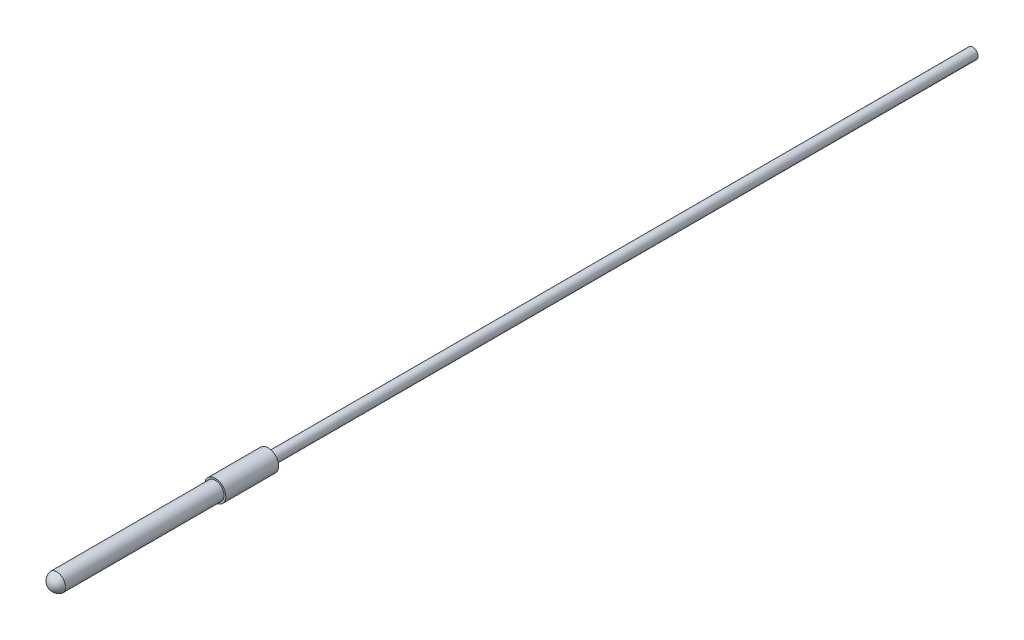
ISO-10303-21;
HEADER;
FILE_DESCRIPTION(('STEP AP214'),'2;1');
FILE_NAME('part.step','',(''),(''),'','','');
FILE_SCHEMA(('AUTOMOTIVE_DESIGN { 1 0 10303 214 1 1 1 1 }'));
ENDSEC;
DATA;
#1=APPLICATION_CONTEXT('core data for automotive mechanical design processes');
#2=APPLICATION_PROTOCOL_DEFINITION('international standard','automotive_design',2000,#1);
#3=PRODUCT_CONTEXT('',#1,'mechanical');
#4=PRODUCT('Part','Part','',(#3));
#5=PRODUCT_RELATED_PRODUCT_CATEGORY('part','',(#4));
#6=PRODUCT_DEFINITION_FORMATION('','',#4);
#7=PRODUCT_DEFINITION_CONTEXT('part definition',#1,'design');
#8=PRODUCT_DEFINITION('design','',#6,#7);
#9=PRODUCT_DEFINITION_SHAPE('','',#8);
#10=(LENGTH_UNIT() NAMED_UNIT(*) SI_UNIT(.MILLI.,.METRE.));
#11=(NAMED_UNIT(*) PLANE_ANGLE_UNIT() SI_UNIT($,.RADIAN.));
#12=(NAMED_UNIT(*) SI_UNIT($,.STERADIAN.) SOLID_ANGLE_UNIT());
#13=UNCERTAINTY_MEASURE_WITH_UNIT(LENGTH_MEASURE(1.E-05),#10,'distance_accuracy_value','');
#14=(GEOMETRIC_REPRESENTATION_CONTEXT(3) GLOBAL_UNCERTAINTY_ASSIGNED_CONTEXT((#13)) GLOBAL_UNIT_ASSIGNED_CONTEXT((#10,
#11,#12)) REPRESENTATION_CONTEXT('',''));
#15=CARTESIAN_POINT('',(0.,0.,0.));
#16=DIRECTION('',(0.,0.,1.));
#17=DIRECTION('',(1.,0.,0.));
#18=AXIS2_PLACEMENT_3D('',#15,#16,#17);
#19=CARTESIAN_POINT('',(0.,0.,45.));
#20=DIRECTION('',(0.,0.,-1.));
#21=DIRECTION('',(-1.,0.,0.));
#22=AXIS2_PLACEMENT_3D('',#19,#20,#21);
#23=CYLINDRICAL_SURFACE('',#22,2.5);
#24=CARTESIAN_POINT('',(0.,0.,45.));
#25=DIRECTION('',(0.,0.,1.));
#26=DIRECTION('',(1.,0.,0.));
#27=AXIS2_PLACEMENT_3D('',#24,#25,#26);
#28=CIRCLE('',#27,2.5);
#29=CARTESIAN_POINT('',(-2.5,0.,45.));
#30=VERTEX_POINT('',#29);
#31=EDGE_CURVE('E36',#30,#30,#28,.T.);
#32=CARTESIAN_POINT('',(0.,0.,0.));
#33=DIRECTION('',(0.,0.,1.));
#34=DIRECTION('',(1.,0.,0.));
#35=AXIS2_PLACEMENT_3D('',#32,#33,#34);
#36=CIRCLE('',#35,2.5);
#37=CARTESIAN_POINT('',(-2.5,0.,0.));
#38=VERTEX_POINT('',#37);
#39=EDGE_CURVE('E44',#38,#38,#36,.T.);
#40=CARTESIAN_POINT('',(-2.5,0.,45.));
#41=CARTESIAN_POINT('',(-2.5,0.,44.53125));
#42=CARTESIAN_POINT('',(-2.5,0.,44.0625));
#43=CARTESIAN_POINT('',(-2.5,0.,43.125));
#44=CARTESIAN_POINT('',(-2.5,0.,42.65625));
#45=CARTESIAN_POINT('',(-2.5,0.,41.71875));
#46=CARTESIAN_POINT('',(-2.5,0.,41.25));
#47=CARTESIAN_POINT('',(-2.5,0.,40.3125));
#48=CARTESIAN_POINT('',(-2.5,0.,39.84375));
#49=CARTESIAN_POINT('',(-2.5,0.,38.90625));
#50=CARTESIAN_POINT('',(-2.5,0.,38.4375));
#51=CARTESIAN_POINT('',(-2.5,0.,37.5));
#52=CARTESIAN_POINT('',(-2.5,0.,37.03125));
#53=CARTESIAN_POINT('',(-2.5,0.,36.09375));
#54=CARTESIAN_POINT('',(-2.5,0.,35.625));
#55=CARTESIAN_POINT('',(-2.5,0.,34.6875));
#56=CARTESIAN_POINT('',(-2.5,0.,34.21875));
#57=CARTESIAN_POINT('',(-2.5,0.,33.28125));
#58=CARTESIAN_POINT('',(-2.5,0.,32.8125));
#59=CARTESIAN_POINT('',(-2.5,0.,31.875));
#60=CARTESIAN_POINT('',(-2.5,0.,31.40625));
#61=CARTESIAN_POINT('',(-2.5,0.,30.46875));
#62=CARTESIAN_POINT('',(-2.5,0.,30.));
#63=CARTESIAN_POINT('',(-2.5,0.,29.0625));
#64=CARTESIAN_POINT('',(-2.5,0.,28.59375));
#65=CARTESIAN_POINT('',(-2.5,0.,27.65625));
#66=CARTESIAN_POINT('',(-2.5,0.,27.1875));
#67=CARTESIAN_POINT('',(-2.5,0.,26.25));
#68=CARTESIAN_POINT('',(-2.5,0.,25.78125));
#69=CARTESIAN_POINT('',(-2.5,0.,24.84375));
#70=CARTESIAN_POINT('',(-2.5,0.,24.375));
#71=CARTESIAN_POINT('',(-2.5,0.,23.4375));
#72=CARTESIAN_POINT('',(-2.5,0.,22.96875));
#73=CARTESIAN_POINT('',(-2.5,0.,22.03125));
#74=CARTESIAN_POINT('',(-2.5,0.,21.5625));
#75=CARTESIAN_POINT('',(-2.5,0.,20.625));
#76=CARTESIAN_POINT('',(-2.5,0.,20.15625));
#77=CARTESIAN_POINT('',(-2.5,0.,19.21875));
#78=CARTESIAN_POINT('',(-2.5,0.,18.75));
#79=CARTESIAN_POINT('',(-2.5,0.,17.8125));
#80=CARTESIAN_POINT('',(-2.5,0.,17.34375));
#81=CARTESIAN_POINT('',(-2.5,0.,16.40625));
#82=CARTESIAN_POINT('',(-2.5,0.,15.9375));
#83=CARTESIAN_POINT('',(-2.5,0.,15.));
#84=CARTESIAN_POINT('',(-2.5,0.,14.53125));
#85=CARTESIAN_POINT('',(-2.5,0.,13.59375));
#86=CARTESIAN_POINT('',(-2.5,0.,13.125));
#87=CARTESIAN_POINT('',(-2.5,0.,12.1875));
#88=CARTESIAN_POINT('',(-2.5,0.,11.71875));
#89=CARTESIAN_POINT('',(-2.5,0.,10.78125));
#90=CARTESIAN_POINT('',(-2.5,0.,10.3125));
#91=CARTESIAN_POINT('',(-2.5,0.,9.37499999999999));
#92=CARTESIAN_POINT('',(-2.5,0.,8.90624999999999));
#93=CARTESIAN_POINT('',(-2.5,0.,7.96874999999999));
#94=CARTESIAN_POINT('',(-2.5,0.,7.5));
#95=CARTESIAN_POINT('',(-2.5,0.,6.56249999999999));
#96=CARTESIAN_POINT('',(-2.5,0.,6.09374999999999));
#97=CARTESIAN_POINT('',(-2.5,0.,5.15624999999999));
#98=CARTESIAN_POINT('',(-2.5,0.,4.68749999999999));
#99=CARTESIAN_POINT('',(-2.5,0.,3.74999999999999));
#100=CARTESIAN_POINT('',(-2.5,0.,3.28124999999999));
#101=CARTESIAN_POINT('',(-2.5,0.,2.34374999999999));
#102=CARTESIAN_POINT('',(-2.5,0.,1.87499999999999));
#103=CARTESIAN_POINT('',(-2.5,0.,0.937499999999992));
#104=CARTESIAN_POINT('',(-2.5,0.,0.468749999999993));
#105=CARTESIAN_POINT('',(-2.5,0.,0.));
#106=B_SPLINE_CURVE_WITH_KNOTS('',3,(#40,#41,#42,#43,#44,#45,#46,#47,#48,#49,#50,#51,#52,#53,
#54,#55,#56,#57,#58,#59,#60,#61,#62,#63,#64,#65,#66,#67,#68,#69,#70,#71,#72,#73,#74,#75,#76,#77,
#78,#79,#80,#81,#82,#83,#84,#85,#86,#87,#88,#89,#90,#91,#92,#93,#94,#95,#96,#97,#98,#99,#100,
#101,#102,#103,#104,#105),.UNSPECIFIED.,.F.,.F.,(4,2,2,2,2,2,2,2,2,2,2,2,2,2,2,2,2,2,2,2,2,2,2,
2,2,2,2,2,2,2,2,2,4),(0.,1.40625,2.8125,4.21874999999999,5.625,7.03125,8.43749999999999,9.84375,
11.25,12.65625,14.0625,15.46875,16.875,18.28125,19.6875,21.09375,22.5,23.90625,25.3125,26.71875,
28.125,29.53125,30.9375,32.34375,33.75,35.15625,36.5625,37.96875,39.375,40.78125,42.1875,
43.59375,45.),.UNSPECIFIED.);
#107=EDGE_CURVE('BSEAM32',#30,#38,#106,.T.);
#108=ORIENTED_EDGE('',*,*,#31,.F.);
#109=ORIENTED_EDGE('',*,*,#39,.T.);
#110=ORIENTED_EDGE('',*,*,#107,.T.);
#111=ORIENTED_EDGE('',*,*,#107,.F.);
#112=EDGE_LOOP('',(#108,#110,#109,#111));
#113=FACE_BOUND('',#112,.T.);
#114=ADVANCED_FACE('F32',(#113),#23,.T.);
#115=CARTESIAN_POINT('',(0.,0.,44.4375));
#116=DIRECTION('',(0.,0.,1.));
#117=DIRECTION('',(1.,0.,0.));
#118=AXIS2_PLACEMENT_3D('',#115,#116,#117);
#119=SPHERICAL_SURFACE('',#118,2.5625);
#120=ORIENTED_EDGE('',*,*,#31,.T.);
#121=EDGE_LOOP('',(#120));
#122=FACE_BOUND('',#121,.T.);
#123=ADVANCED_FACE('F34',(#122),#119,.T.);
#124=CARTESIAN_POINT('',(0.,0.,-15.));
#125=DIRECTION('',(0.,0.,1.));
#126=DIRECTION('',(1.,0.,0.));
#127=AXIS2_PLACEMENT_3D('',#124,#125,#126);
#128=CYLINDRICAL_SURFACE('',#127,3.);
#129=CARTESIAN_POINT('',(0.,0.,-15.));
#130=DIRECTION('',(0.,0.,-1.));
#131=DIRECTION('',(-1.,0.,0.));
#132=AXIS2_PLACEMENT_3D('',#129,#130,#131);
#133=CIRCLE('',#132,3.);
#134=CARTESIAN_POINT('',(3.,0.,-15.));
#135=VERTEX_POINT('',#134);
#136=EDGE_CURVE('E48',#135,#135,#133,.T.);
#137=CARTESIAN_POINT('',(0.,0.,0.));
#138=DIRECTION('',(0.,0.,-1.));
#139=DIRECTION('',(-1.,0.,0.));
#140=AXIS2_PLACEMENT_3D('',#137,#138,#139);
#141=CIRCLE('',#140,3.);
#142=CARTESIAN_POINT('',(3.,0.,0.));
#143=VERTEX_POINT('',#142);
#144=EDGE_CURVE('E51',#143,#143,#141,.T.);
#145=CARTESIAN_POINT('',(3.,0.,-15.));
#146=CARTESIAN_POINT('',(3.,0.,-14.84375));
#147=CARTESIAN_POINT('',(3.,0.,-14.6875));
#148=CARTESIAN_POINT('',(3.,0.,-14.375));
#149=CARTESIAN_POINT('',(3.,0.,-14.21875));
#150=CARTESIAN_POINT('',(3.,0.,-13.90625));
#151=CARTESIAN_POINT('',(3.,0.,-13.75));
#152=CARTESIAN_POINT('',(3.,0.,-13.4375));
#153=CARTESIAN_POINT('',(3.,0.,-13.28125));
#154=CARTESIAN_POINT('',(3.,0.,-12.96875));
#155=CARTESIAN_POINT('',(3.,0.,-12.8125));
#156=CARTESIAN_POINT('',(3.,0.,-12.5));
#157=CARTESIAN_POINT('',(3.,0.,-12.34375));
#158=CARTESIAN_POINT('',(3.,0.,-12.03125));
#159=CARTESIAN_POINT('',(3.,0.,-11.875));
#160=CARTESIAN_POINT('',(3.,0.,-11.5625));
#161=CARTESIAN_POINT('',(3.,0.,-11.40625));
#162=CARTESIAN_POINT('',(3.,0.,-11.09375));
#163=CARTESIAN_POINT('',(3.,0.,-10.9375));
#164=CARTESIAN_POINT('',(3.,0.,-10.625));
#165=CARTESIAN_POINT('',(3.,0.,-10.46875));
#166=CARTESIAN_POINT('',(3.,0.,-10.15625));
#167=CARTESIAN_POINT('',(3.,0.,-9.99999999999999));
#168=CARTESIAN_POINT('',(3.,0.,-9.68749999999999));
#169=CARTESIAN_POINT('',(3.,0.,-9.53125));
#170=CARTESIAN_POINT('',(3.,0.,-9.21875));
#171=CARTESIAN_POINT('',(3.,0.,-9.0625));
#172=CARTESIAN_POINT('',(3.,0.,-8.75));
#173=CARTESIAN_POINT('',(3.,0.,-8.59375));
#174=CARTESIAN_POINT('',(3.,0.,-8.28125));
#175=CARTESIAN_POINT('',(3.,0.,-8.125));
#176=CARTESIAN_POINT('',(3.,0.,-7.8125));
#177=CARTESIAN_POINT('',(3.,0.,-7.65625));
#178=CARTESIAN_POINT('',(3.,0.,-7.34375));
#179=CARTESIAN_POINT('',(3.,0.,-7.1875));
#180=CARTESIAN_POINT('',(3.,0.,-6.875));
#181=CARTESIAN_POINT('',(3.,0.,-6.71875));
#182=CARTESIAN_POINT('',(3.,0.,-6.40625));
#183=CARTESIAN_POINT('',(3.,0.,-6.25));
#184=CARTESIAN_POINT('',(3.,0.,-5.9375));
#185=CARTESIAN_POINT('',(3.,0.,-5.78125));
#186=CARTESIAN_POINT('',(3.,0.,-5.46875));
#187=CARTESIAN_POINT('',(3.,0.,-5.3125));
#188=CARTESIAN_POINT('',(3.,0.,-5.));
#189=CARTESIAN_POINT('',(3.,0.,-4.84375));
#190=CARTESIAN_POINT('',(3.,0.,-4.53125));
#191=CARTESIAN_POINT('',(3.,0.,-4.375));
#192=CARTESIAN_POINT('',(3.,0.,-4.0625));
#193=CARTESIAN_POINT('',(3.,0.,-3.90625));
#194=CARTESIAN_POINT('',(3.,0.,-3.59375));
#195=CARTESIAN_POINT('',(3.,0.,-3.4375));
#196=CARTESIAN_POINT('',(3.,0.,-3.125));
#197=CARTESIAN_POINT('',(3.,0.,-2.96875));
#198=CARTESIAN_POINT('',(3.,0.,-2.65625));
#199=CARTESIAN_POINT('',(3.,0.,-2.5));
#200=CARTESIAN_POINT('',(3.,0.,-2.1875));
#201=CARTESIAN_POINT('',(3.,0.,-2.03125));
#202=CARTESIAN_POINT('',(3.,0.,-1.71875));
#203=CARTESIAN_POINT('',(3.,0.,-1.5625));
#204=CARTESIAN_POINT('',(3.,0.,-1.25));
#205=CARTESIAN_POINT('',(3.,0.,-1.09375));
#206=CARTESIAN_POINT('',(3.,0.,-0.78125));
#207=CARTESIAN_POINT('',(3.,0.,-0.625));
#208=CARTESIAN_POINT('',(3.,0.,-0.3125));
#209=CARTESIAN_POINT('',(3.,0.,-0.15625));
#210=CARTESIAN_POINT('',(3.,0.,0.));
#211=B_SPLINE_CURVE_WITH_KNOTS('',3,(#145,#146,#147,#148,#149,#150,#151,#152,#153,#154,#155,
#156,#157,#158,#159,#160,#161,#162,#163,#164,#165,#166,#167,#168,#169,#170,#171,#172,#173,#174,
#175,#176,#177,#178,#179,#180,#181,#182,#183,#184,#185,#186,#187,#188,#189,#190,#191,#192,#193,
#194,#195,#196,#197,#198,#199,#200,#201,#202,#203,#204,#205,#206,#207,#208,#209,#210),
.UNSPECIFIED.,.F.,.F.,(4,2,2,2,2,2,2,2,2,2,2,2,2,2,2,2,2,2,2,2,2,2,2,2,2,2,2,2,2,2,2,2,4),(0.,
0.46875,0.937500000000001,1.40625,1.875,2.34375,2.8125,3.28125,3.75,4.21875,4.6875,5.15625,
5.625,6.09375,6.5625,7.03125,7.5,7.96875,8.43749999999999,8.90625,9.375,9.84374999999999,
10.3125,10.78125,11.25,11.71875,12.1875,12.65625,13.125,13.59375,14.0625,14.53125,15.),.UNSPECIFIED.);
#212=EDGE_CURVE('BSEAM65',#135,#143,#211,.T.);
#213=ORIENTED_EDGE('',*,*,#136,.F.);
#214=ORIENTED_EDGE('',*,*,#144,.T.);
#215=ORIENTED_EDGE('',*,*,#212,.T.);
#216=ORIENTED_EDGE('',*,*,#212,.F.);
#217=EDGE_LOOP('',(#213,#215,#214,#216));
#218=FACE_BOUND('',#217,.T.);
#219=ADVANCED_FACE('F65',(#218),#128,.T.);
#220=CARTESIAN_POINT('',(0.,0.,-15.));
#221=DIRECTION('',(0.,0.,-1.));
#222=DIRECTION('',(-1.,0.,0.));
#223=AXIS2_PLACEMENT_3D('',#220,#221,#222);
#224=PLANE('',#223);
#225=CARTESIAN_POINT('',(0.,0.,-15.));
#226=DIRECTION('',(0.,0.,-1.));
#227=DIRECTION('',(-1.,0.,0.));
#228=AXIS2_PLACEMENT_3D('',#225,#226,#227);
#229=CIRCLE('',#228,1.5);
#230=CARTESIAN_POINT('',(-1.5,0.,-15.));
#231=VERTEX_POINT('',#230);
#232=EDGE_CURVE('E10',#231,#231,#229,.T.);
#233=ORIENTED_EDGE('',*,*,#232,.F.);
#234=EDGE_LOOP('',(#233));
#235=FACE_BOUND('',#234,.T.);
#236=ORIENTED_EDGE('',*,*,#136,.T.);
#237=EDGE_LOOP('',(#236));
#238=FACE_BOUND('',#237,.T.);
#239=ADVANCED_FACE('F61',(#235,#238),#224,.T.);
#240=CARTESIAN_POINT('',(0.,0.,0.));
#241=DIRECTION('',(0.,0.,-1.));
#242=DIRECTION('',(-1.,0.,0.));
#243=AXIS2_PLACEMENT_3D('',#240,#241,#242);
#244=PLANE('',#243);
#245=ORIENTED_EDGE('',*,*,#39,.F.);
#246=EDGE_LOOP('',(#245));
#247=FACE_BOUND('',#246,.T.);
#248=ORIENTED_EDGE('',*,*,#144,.F.);
#249=EDGE_LOOP('',(#248));
#250=FACE_BOUND('',#249,.T.);
#251=ADVANCED_FACE('F57',(#247,#250),#244,.F.);
#252=CARTESIAN_POINT('',(0.,0.,-215.));
#253=DIRECTION('',(0.,0.,1.));
#254=DIRECTION('',(1.,0.,0.));
#255=AXIS2_PLACEMENT_3D('',#252,#253,#254);
#256=CYLINDRICAL_SURFACE('',#255,1.5);
#257=CARTESIAN_POINT('',(0.,0.,-215.));
#258=DIRECTION('',(0.,0.,-1.));
#259=DIRECTION('',(-1.,0.,0.));
#260=AXIS2_PLACEMENT_3D('',#257,#258,#259);
#261=CIRCLE('',#260,1.5);
#262=CARTESIAN_POINT('',(-1.5,0.,-215.));
#263=VERTEX_POINT('',#262);
#264=EDGE_CURVE('E47',#263,#263,#261,.T.);
#265=ORIENTED_EDGE('',*,*,#264,.F.);
#266=EDGE_LOOP('',(#265));
#267=FACE_BOUND('',#266,.T.);
#268=ORIENTED_EDGE('',*,*,#232,.T.);
#269=EDGE_LOOP('',(#268));
#270=FACE_BOUND('',#269,.T.);
#271=ADVANCED_FACE('F60',(#267,#270),#256,.T.);
#272=CARTESIAN_POINT('',(0.,0.,-215.));
#273=DIRECTION('',(0.,0.,-1.));
#274=DIRECTION('',(-1.,0.,0.));
#275=AXIS2_PLACEMENT_3D('',#272,#273,#274);
#276=PLANE('',#275);
#277=ORIENTED_EDGE('',*,*,#264,.T.);
#278=EDGE_LOOP('',(#277));
#279=FACE_BOUND('',#278,.T.);
#280=ADVANCED_FACE('F116',(#279),#276,.T.);
#281=CLOSED_SHELL('',(#114,#123,#219,#239,#251,#271,#280));
#282=MANIFOLD_SOLID_BREP('B2',#281);
#283=ADVANCED_BREP_SHAPE_REPRESENTATION('',(#18,#282),#14);
#284=SHAPE_DEFINITION_REPRESENTATION(#9,#283);
ENDSEC;
END-ISO-10303-21;
